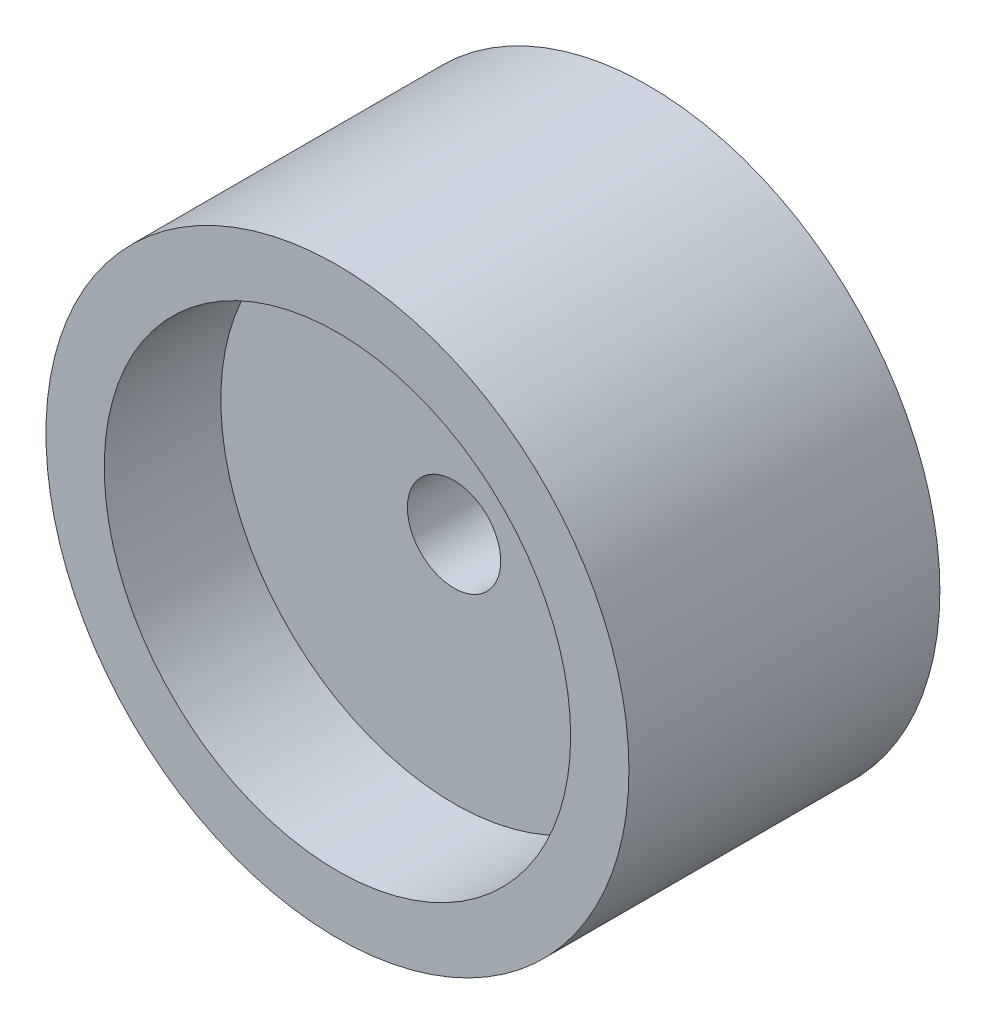
ISO-10303-21;
HEADER;
FILE_DESCRIPTION(('STEP AP214'),'2;1');
FILE_NAME('part.step','',(''),(''),'','','');
FILE_SCHEMA(('AUTOMOTIVE_DESIGN { 1 0 10303 214 1 1 1 1 }'));
ENDSEC;
DATA;
#1=APPLICATION_CONTEXT('core data for automotive mechanical design processes');
#2=APPLICATION_PROTOCOL_DEFINITION('international standard','automotive_design',2000,#1);
#3=PRODUCT_CONTEXT('',#1,'mechanical');
#4=PRODUCT('Part','Part','',(#3));
#5=PRODUCT_RELATED_PRODUCT_CATEGORY('part','',(#4));
#6=PRODUCT_DEFINITION_FORMATION('','',#4);
#7=PRODUCT_DEFINITION_CONTEXT('part definition',#1,'design');
#8=PRODUCT_DEFINITION('design','',#6,#7);
#9=PRODUCT_DEFINITION_SHAPE('','',#8);
#10=(LENGTH_UNIT() NAMED_UNIT(*) SI_UNIT(.MILLI.,.METRE.));
#11=(NAMED_UNIT(*) PLANE_ANGLE_UNIT() SI_UNIT($,.RADIAN.));
#12=(NAMED_UNIT(*) SI_UNIT($,.STERADIAN.) SOLID_ANGLE_UNIT());
#13=UNCERTAINTY_MEASURE_WITH_UNIT(LENGTH_MEASURE(1.E-05),#10,'distance_accuracy_value','');
#14=(GEOMETRIC_REPRESENTATION_CONTEXT(3) GLOBAL_UNCERTAINTY_ASSIGNED_CONTEXT((#13)) GLOBAL_UNIT_ASSIGNED_CONTEXT((#10,
#11,#12)) REPRESENTATION_CONTEXT('',''));
#15=CARTESIAN_POINT('',(0.,0.,0.));
#16=DIRECTION('',(0.,0.,1.));
#17=DIRECTION('',(1.,0.,0.));
#18=AXIS2_PLACEMENT_3D('',#15,#16,#17);
#19=CARTESIAN_POINT('',(0.,0.,8.));
#20=DIRECTION('',(0.,0.,-1.));
#21=DIRECTION('',(-1.,0.,0.));
#22=AXIS2_PLACEMENT_3D('',#19,#20,#21);
#23=CYLINDRICAL_SURFACE('',#22,7.5);
#24=CARTESIAN_POINT('',(0.,0.,8.));
#25=DIRECTION('',(0.,0.,1.));
#26=DIRECTION('',(1.,0.,0.));
#27=AXIS2_PLACEMENT_3D('',#24,#25,#26);
#28=CIRCLE('',#27,7.5);
#29=CARTESIAN_POINT('',(7.5,0.,8.));
#30=VERTEX_POINT('',#29);
#31=EDGE_CURVE('E10',#30,#30,#28,.T.);
#32=ORIENTED_EDGE('',*,*,#31,.F.);
#33=EDGE_LOOP('',(#32));
#34=FACE_BOUND('',#33,.T.);
#35=CARTESIAN_POINT('',(0.,0.,0.));
#36=DIRECTION('',(0.,0.,1.));
#37=DIRECTION('',(1.,0.,0.));
#38=AXIS2_PLACEMENT_3D('',#35,#36,#37);
#39=CIRCLE('',#38,7.5);
#40=CARTESIAN_POINT('',(7.5,0.,0.));
#41=VERTEX_POINT('',#40);
#42=EDGE_CURVE('E34',#41,#41,#39,.T.);
#43=ORIENTED_EDGE('',*,*,#42,.T.);
#44=EDGE_LOOP('',(#43));
#45=FACE_BOUND('',#44,.T.);
#46=ADVANCED_FACE('F31',(#34,#45),#23,.T.);
#47=CARTESIAN_POINT('',(0.,0.,8.));
#48=DIRECTION('',(0.,0.,1.));
#49=DIRECTION('',(1.,0.,0.));
#50=AXIS2_PLACEMENT_3D('',#47,#48,#49);
#51=PLANE('',#50);
#52=CARTESIAN_POINT('',(0.,0.,8.));
#53=DIRECTION('',(0.,0.,1.));
#54=DIRECTION('',(1.,0.,0.));
#55=AXIS2_PLACEMENT_3D('',#52,#53,#54);
#56=CIRCLE('',#55,6.);
#57=CARTESIAN_POINT('',(6.,0.,8.));
#58=VERTEX_POINT('',#57);
#59=EDGE_CURVE('E43',#58,#58,#56,.T.);
#60=ORIENTED_EDGE('',*,*,#59,.F.);
#61=EDGE_LOOP('',(#60));
#62=FACE_BOUND('',#61,.T.);
#63=ORIENTED_EDGE('',*,*,#31,.T.);
#64=EDGE_LOOP('',(#63));
#65=FACE_BOUND('',#64,.T.);
#66=ADVANCED_FACE('F70',(#62,#65),#51,.T.);
#67=CARTESIAN_POINT('',(0.,0.,0.));
#68=DIRECTION('',(0.,0.,1.));
#69=DIRECTION('',(1.,0.,0.));
#70=AXIS2_PLACEMENT_3D('',#67,#68,#69);
#71=PLANE('',#70);
#72=CARTESIAN_POINT('',(0.,0.,0.));
#73=DIRECTION('',(0.,0.,-1.));
#74=DIRECTION('',(-1.,0.,0.));
#75=AXIS2_PLACEMENT_3D('',#72,#73,#74);
#76=CIRCLE('',#75,2.275);
#77=CARTESIAN_POINT('',(-2.275,0.,0.));
#78=VERTEX_POINT('',#77);
#79=EDGE_CURVE('E60',#78,#78,#76,.T.);
#80=ORIENTED_EDGE('',*,*,#79,.F.);
#81=EDGE_LOOP('',(#80));
#82=FACE_BOUND('',#81,.T.);
#83=ORIENTED_EDGE('',*,*,#42,.F.);
#84=EDGE_LOOP('',(#83));
#85=FACE_BOUND('',#84,.T.);
#86=ADVANCED_FACE('F66',(#82,#85),#71,.F.);
#87=CARTESIAN_POINT('',(0.,0.,5.));
#88=DIRECTION('',(0.,0.,1.));
#89=DIRECTION('',(1.,0.,0.));
#90=AXIS2_PLACEMENT_3D('',#87,#88,#89);
#91=CYLINDRICAL_SURFACE('',#90,6.);
#92=CARTESIAN_POINT('',(0.,0.,5.));
#93=DIRECTION('',(0.,0.,1.));
#94=DIRECTION('',(1.,0.,0.));
#95=AXIS2_PLACEMENT_3D('',#92,#93,#94);
#96=CIRCLE('',#95,6.);
#97=CARTESIAN_POINT('',(6.,0.,5.));
#98=VERTEX_POINT('',#97);
#99=EDGE_CURVE('E41',#98,#98,#96,.T.);
#100=ORIENTED_EDGE('',*,*,#99,.F.);
#101=EDGE_LOOP('',(#100));
#102=FACE_BOUND('',#101,.T.);
#103=ORIENTED_EDGE('',*,*,#59,.T.);
#104=EDGE_LOOP('',(#103));
#105=FACE_BOUND('',#104,.T.);
#106=ADVANCED_FACE('F69',(#102,#105),#91,.F.);
#107=CARTESIAN_POINT('',(0.,0.,5.));
#108=DIRECTION('',(0.,0.,1.));
#109=DIRECTION('',(1.,0.,0.));
#110=AXIS2_PLACEMENT_3D('',#107,#108,#109);
#111=PLANE('',#110);
#112=CARTESIAN_POINT('',(0.,0.,4.99999999999999));
#113=DIRECTION('',(0.,0.,-1.));
#114=DIRECTION('',(-1.,0.,0.));
#115=AXIS2_PLACEMENT_3D('',#112,#113,#114);
#116=CIRCLE('',#115,1.2);
#117=CARTESIAN_POINT('',(-1.2,0.,4.99999999999999));
#118=VERTEX_POINT('',#117);
#119=EDGE_CURVE('E46',#118,#118,#116,.T.);
#120=ORIENTED_EDGE('',*,*,#119,.T.);
#121=EDGE_LOOP('',(#120));
#122=FACE_BOUND('',#121,.T.);
#123=ORIENTED_EDGE('',*,*,#99,.T.);
#124=EDGE_LOOP('',(#123));
#125=FACE_BOUND('',#124,.T.);
#126=ADVANCED_FACE('F86',(#122,#125),#111,.T.);
#127=CARTESIAN_POINT('',(0.,0.,0.));
#128=DIRECTION('',(0.,0.,-1.));
#129=DIRECTION('',(-1.,0.,0.));
#130=AXIS2_PLACEMENT_3D('',#127,#128,#129);
#131=CYLINDRICAL_SURFACE('',#130,1.2);
#132=ORIENTED_EDGE('',*,*,#119,.F.);
#133=EDGE_LOOP('',(#132));
#134=FACE_BOUND('',#133,.T.);
#135=CARTESIAN_POINT('',(0.,0.,2.));
#136=DIRECTION('',(0.,0.,-1.));
#137=DIRECTION('',(-1.,0.,0.));
#138=AXIS2_PLACEMENT_3D('',#135,#136,#137);
#139=CIRCLE('',#138,1.2);
#140=CARTESIAN_POINT('',(-1.2,0.,2.));
#141=VERTEX_POINT('',#140);
#142=EDGE_CURVE('E51',#141,#141,#139,.T.);
#143=ORIENTED_EDGE('',*,*,#142,.T.);
#144=EDGE_LOOP('',(#143));
#145=FACE_BOUND('',#144,.T.);
#146=ADVANCED_FACE('F90',(#134,#145),#131,.F.);
#147=CARTESIAN_POINT('',(1.2,0.,2.));
#148=DIRECTION('',(0.,0.,1.));
#149=DIRECTION('',(1.,0.,0.));
#150=AXIS2_PLACEMENT_3D('',#147,#148,#149);
#151=PLANE('',#150);
#152=ORIENTED_EDGE('',*,*,#142,.F.);
#153=EDGE_LOOP('',(#152));
#154=FACE_BOUND('',#153,.T.);
#155=CARTESIAN_POINT('',(0.,0.,2.));
#156=DIRECTION('',(0.,0.,-1.));
#157=DIRECTION('',(-1.,0.,0.));
#158=AXIS2_PLACEMENT_3D('',#155,#156,#157);
#159=CIRCLE('',#158,2.25);
#160=CARTESIAN_POINT('',(-2.25,0.,2.));
#161=VERTEX_POINT('',#160);
#162=EDGE_CURVE('E54',#161,#161,#159,.T.);
#163=ORIENTED_EDGE('',*,*,#162,.T.);
#164=EDGE_LOOP('',(#163));
#165=FACE_BOUND('',#164,.T.);
#166=ADVANCED_FACE('F94',(#154,#165),#151,.F.);
#167=CARTESIAN_POINT('',(0.,0.,0.));
#168=DIRECTION('',(0.,0.,-1.));
#169=DIRECTION('',(-1.,0.,0.));
#170=AXIS2_PLACEMENT_3D('',#167,#168,#169);
#171=CYLINDRICAL_SURFACE('',#170,2.25);
#172=ORIENTED_EDGE('',*,*,#162,.F.);
#173=EDGE_LOOP('',(#172));
#174=FACE_BOUND('',#173,.T.);
#175=CARTESIAN_POINT('',(0.,0.,0.0249999999999985));
#176=DIRECTION('',(0.,0.,-1.));
#177=DIRECTION('',(-1.,0.,0.));
#178=AXIS2_PLACEMENT_3D('',#175,#176,#177);
#179=CIRCLE('',#178,2.25);
#180=CARTESIAN_POINT('',(-2.25,0.,0.0249999999999985));
#181=VERTEX_POINT('',#180);
#182=EDGE_CURVE('E57',#181,#181,#179,.T.);
#183=ORIENTED_EDGE('',*,*,#182,.T.);
#184=EDGE_LOOP('',(#183));
#185=FACE_BOUND('',#184,.T.);
#186=ADVANCED_FACE('F98',(#174,#185),#171,.F.);
#187=CARTESIAN_POINT('',(0.,0.,0.));
#188=DIRECTION('',(0.,0.,-1.));
#189=DIRECTION('',(-1.,0.,0.));
#190=AXIS2_PLACEMENT_3D('',#187,#188,#189);
#191=CONICAL_SURFACE('',#190,2.275,0.785398163397492);
#192=ORIENTED_EDGE('',*,*,#182,.F.);
#193=EDGE_LOOP('',(#192));
#194=FACE_BOUND('',#193,.T.);
#195=ORIENTED_EDGE('',*,*,#79,.T.);
#196=EDGE_LOOP('',(#195));
#197=FACE_BOUND('',#196,.T.);
#198=ADVANCED_FACE('F64',(#194,#197),#191,.F.);
#199=CLOSED_SHELL('',(#46,#66,#86,#106,#126,#146,#166,#186,#198));
#200=MANIFOLD_SOLID_BREP('B2',#199);
#201=ADVANCED_BREP_SHAPE_REPRESENTATION('',(#18,#200),#14);
#202=SHAPE_DEFINITION_REPRESENTATION(#9,#201);
ENDSEC;
END-ISO-10303-21;
